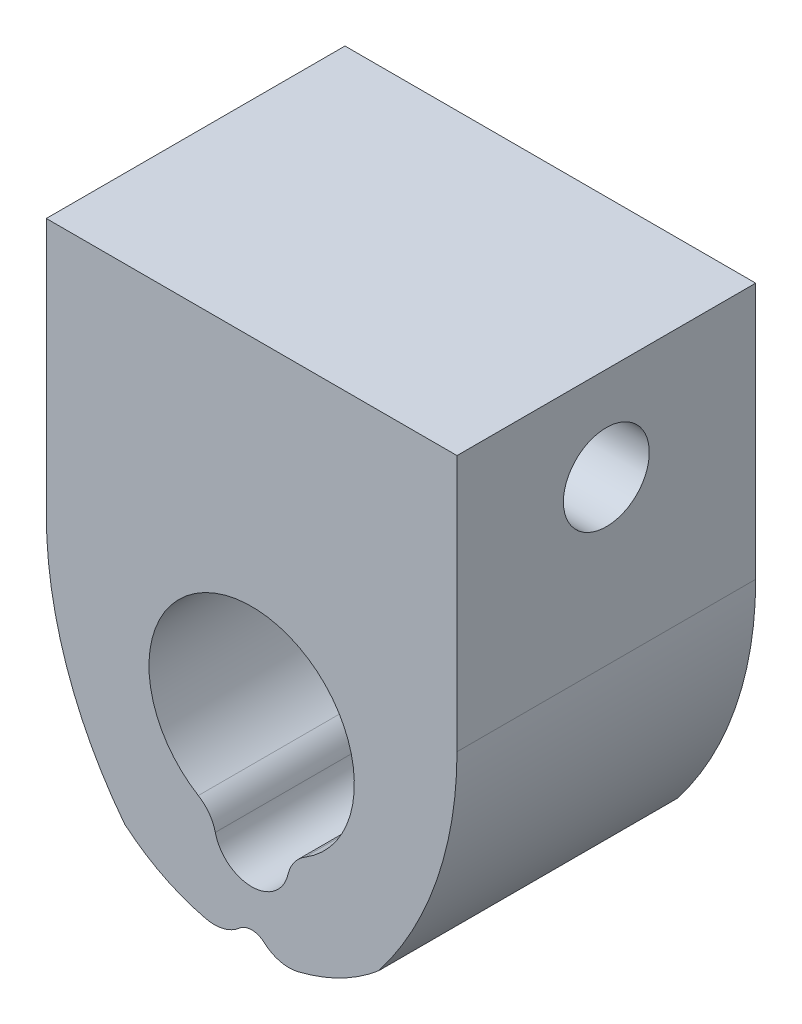
ISO-10303-21;
HEADER;
FILE_DESCRIPTION(('STEP AP214'),'2;1');
FILE_NAME('part.step','',(''),(''),'','','');
FILE_SCHEMA(('AUTOMOTIVE_DESIGN { 1 0 10303 214 1 1 1 1 }'));
ENDSEC;
DATA;
#1=APPLICATION_CONTEXT('core data for automotive mechanical design processes');
#2=APPLICATION_PROTOCOL_DEFINITION('international standard','automotive_design',2000,#1);
#3=PRODUCT_CONTEXT('',#1,'mechanical');
#4=PRODUCT('Part','Part','',(#3));
#5=PRODUCT_RELATED_PRODUCT_CATEGORY('part','',(#4));
#6=PRODUCT_DEFINITION_FORMATION('','',#4);
#7=PRODUCT_DEFINITION_CONTEXT('part definition',#1,'design');
#8=PRODUCT_DEFINITION('design','',#6,#7);
#9=PRODUCT_DEFINITION_SHAPE('','',#8);
#10=(LENGTH_UNIT() NAMED_UNIT(*) SI_UNIT(.MILLI.,.METRE.));
#11=(NAMED_UNIT(*) PLANE_ANGLE_UNIT() SI_UNIT($,.RADIAN.));
#12=(NAMED_UNIT(*) SI_UNIT($,.STERADIAN.) SOLID_ANGLE_UNIT());
#13=UNCERTAINTY_MEASURE_WITH_UNIT(LENGTH_MEASURE(1.E-05),#10,'distance_accuracy_value','');
#14=(GEOMETRIC_REPRESENTATION_CONTEXT(3) GLOBAL_UNCERTAINTY_ASSIGNED_CONTEXT((#13)) GLOBAL_UNIT_ASSIGNED_CONTEXT((#10,
#11,#12)) REPRESENTATION_CONTEXT('',''));
#15=CARTESIAN_POINT('',(0.,0.,0.));
#16=DIRECTION('',(0.,0.,1.));
#17=DIRECTION('',(1.,0.,0.));
#18=AXIS2_PLACEMENT_3D('',#15,#16,#17);
#19=CARTESIAN_POINT('',(0.998865569685858,-4.13095238095238,-6.91465834296967));
#20=DIRECTION('',(0.,0.,-1.));
#21=DIRECTION('',(-1.,0.,0.));
#22=AXIS2_PLACEMENT_3D('',#19,#20,#21);
#23=CYLINDRICAL_SURFACE('',#22,1.);
#24=CARTESIAN_POINT('',(0.998865569685858,-4.13095238095238,0.));
#25=DIRECTION('',(0.,0.,-1.));
#26=DIRECTION('',(-1.,0.,0.));
#27=AXIS2_PLACEMENT_3D('',#24,#25,#26);
#28=CIRCLE('',#27,1.);
#29=CARTESIAN_POINT('',(1.23389276255312,-5.10294117647059,0.));
#30=VERTEX_POINT('',#29);
#31=CARTESIAN_POINT('',(0.332955189895285,-4.87698412698413,0.));
#32=VERTEX_POINT('',#31);
#33=EDGE_CURVE('E260',#30,#32,#28,.T.);
#34=ORIENTED_EDGE('',*,*,#33,.F.);
#35=DIRECTION('',(0.,0.,-1.));
#36=VECTOR('',#35,1.);
#37=CARTESIAN_POINT('',(1.23389276255312,-5.10294117647059,-6.91465834296967));
#38=LINE('',#37,#36);
#39=CARTESIAN_POINT('',(1.23389276255312,-5.10294117647059,8.));
#40=VERTEX_POINT('',#39);
#41=EDGE_CURVE('E326',#40,#30,#38,.T.);
#42=ORIENTED_EDGE('',*,*,#41,.F.);
#43=CARTESIAN_POINT('',(0.998865569685858,-4.13095238095238,8.));
#44=DIRECTION('',(0.,0.,1.));
#45=DIRECTION('',(-1.,0.,0.));
#46=AXIS2_PLACEMENT_3D('',#43,#44,#45);
#47=CIRCLE('',#46,1.);
#48=CARTESIAN_POINT('',(0.332955189895285,-4.87698412698413,8.));
#49=VERTEX_POINT('',#48);
#50=EDGE_CURVE('E218',#49,#40,#47,.T.);
#51=ORIENTED_EDGE('',*,*,#50,.F.);
#52=DIRECTION('',(0.,0.,1.));
#53=VECTOR('',#52,1.);
#54=CARTESIAN_POINT('',(0.332955189895285,-4.87698412698413,0.));
#55=LINE('',#54,#53);
#56=EDGE_CURVE('E296',#32,#49,#55,.T.);
#57=ORIENTED_EDGE('',*,*,#56,.F.);
#58=EDGE_LOOP('',(#34,#42,#51,#57));
#59=FACE_BOUND('',#58,.T.);
#60=ADVANCED_FACE('F17',(#59),#23,.T.);
#61=CARTESIAN_POINT('',(-0.998865569685859,-4.13095238095238,-6.91465834296967));
#62=DIRECTION('',(0.,0.,1.));
#63=DIRECTION('',(1.,0.,0.));
#64=AXIS2_PLACEMENT_3D('',#61,#62,#63);
#65=CYLINDRICAL_SURFACE('',#64,1.);
#66=CARTESIAN_POINT('',(-0.998865569685859,-4.13095238095238,8.));
#67=DIRECTION('',(0.,0.,1.));
#68=DIRECTION('',(-1.,0.,0.));
#69=AXIS2_PLACEMENT_3D('',#66,#67,#68);
#70=CIRCLE('',#69,1.);
#71=CARTESIAN_POINT('',(-1.23389276255312,-5.10294117647059,8.));
#72=VERTEX_POINT('',#71);
#73=CARTESIAN_POINT('',(-0.332955189895287,-4.87698412698413,8.));
#74=VERTEX_POINT('',#73);
#75=EDGE_CURVE('E206',#72,#74,#70,.T.);
#76=ORIENTED_EDGE('',*,*,#75,.F.);
#77=DIRECTION('',(0.,0.,1.));
#78=VECTOR('',#77,1.);
#79=CARTESIAN_POINT('',(-1.23389276255312,-5.10294117647059,-6.91465834296967));
#80=LINE('',#79,#78);
#81=CARTESIAN_POINT('',(-1.23389276255312,-5.10294117647059,0.));
#82=VERTEX_POINT('',#81);
#83=EDGE_CURVE('E200',#82,#72,#80,.T.);
#84=ORIENTED_EDGE('',*,*,#83,.F.);
#85=CARTESIAN_POINT('',(-0.998865569685859,-4.13095238095238,0.));
#86=DIRECTION('',(0.,0.,-1.));
#87=DIRECTION('',(-1.,0.,0.));
#88=AXIS2_PLACEMENT_3D('',#85,#86,#87);
#89=CIRCLE('',#88,1.);
#90=CARTESIAN_POINT('',(-0.332955189895287,-4.87698412698413,0.));
#91=VERTEX_POINT('',#90);
#92=EDGE_CURVE('E251',#91,#82,#89,.T.);
#93=ORIENTED_EDGE('',*,*,#92,.F.);
#94=DIRECTION('',(0.,0.,-1.));
#95=VECTOR('',#94,1.);
#96=CARTESIAN_POINT('',(-0.332955189895287,-4.87698412698413,0.));
#97=LINE('',#96,#95);
#98=EDGE_CURVE('E298',#74,#91,#97,.T.);
#99=ORIENTED_EDGE('',*,*,#98,.F.);
#100=EDGE_LOOP('',(#76,#84,#93,#99));
#101=FACE_BOUND('',#100,.T.);
#102=ADVANCED_FACE('F316',(#101),#65,.T.);
#103=CARTESIAN_POINT('',(1.94766229869351,-3.20454545454546,8.));
#104=DIRECTION('',(0.,0.,-1.));
#105=DIRECTION('',(-1.,0.,0.));
#106=AXIS2_PLACEMENT_3D('',#103,#104,#105);
#107=CYLINDRICAL_SURFACE('',#106,1.);
#108=CARTESIAN_POINT('',(1.94766229869351,-3.20454545454546,8.));
#109=DIRECTION('',(0.,0.,1.));
#110=DIRECTION('',(-1.,0.,0.));
#111=AXIS2_PLACEMENT_3D('',#108,#109,#110);
#112=CIRCLE('',#111,1.);
#113=CARTESIAN_POINT('',(1.42828568570857,-2.35,8.));
#114=VERTEX_POINT('',#113);
#115=CARTESIAN_POINT('',(0.973831149346752,-2.97727272727273,8.));
#116=VERTEX_POINT('',#115);
#117=EDGE_CURVE('E152',#114,#116,#112,.T.);
#118=ORIENTED_EDGE('',*,*,#117,.F.);
#119=DIRECTION('',(0.,0.,1.));
#120=VECTOR('',#119,1.);
#121=CARTESIAN_POINT('',(1.42828568570857,-2.35,8.));
#122=LINE('',#121,#120);
#123=CARTESIAN_POINT('',(1.42828568570857,-2.35,0.));
#124=VERTEX_POINT('',#123);
#125=EDGE_CURVE('E160',#124,#114,#122,.T.);
#126=ORIENTED_EDGE('',*,*,#125,.F.);
#127=CARTESIAN_POINT('',(1.94766229869351,-3.20454545454546,0.));
#128=DIRECTION('',(0.,0.,-1.));
#129=DIRECTION('',(-1.,0.,0.));
#130=AXIS2_PLACEMENT_3D('',#127,#128,#129);
#131=CIRCLE('',#130,1.);
#132=CARTESIAN_POINT('',(0.973831149346752,-2.97727272727273,0.));
#133=VERTEX_POINT('',#132);
#134=EDGE_CURVE('E287',#133,#124,#131,.T.);
#135=ORIENTED_EDGE('',*,*,#134,.F.);
#136=DIRECTION('',(0.,0.,-1.));
#137=VECTOR('',#136,1.);
#138=CARTESIAN_POINT('',(0.973831149346752,-2.97727272727273,0.));
#139=LINE('',#138,#137);
#140=EDGE_CURVE('E11',#116,#133,#139,.T.);
#141=ORIENTED_EDGE('',*,*,#140,.F.);
#142=EDGE_LOOP('',(#118,#126,#135,#141));
#143=FACE_BOUND('',#142,.T.);
#144=ADVANCED_FACE('F156',(#143),#107,.T.);
#145=CARTESIAN_POINT('',(-1.94766229869351,-3.20454545454546,8.));
#146=DIRECTION('',(0.,0.,1.));
#147=DIRECTION('',(1.,0.,0.));
#148=AXIS2_PLACEMENT_3D('',#145,#146,#147);
#149=CYLINDRICAL_SURFACE('',#148,1.);
#150=CARTESIAN_POINT('',(-1.94766229869351,-3.20454545454546,0.));
#151=DIRECTION('',(0.,0.,-1.));
#152=DIRECTION('',(-1.,0.,0.));
#153=AXIS2_PLACEMENT_3D('',#150,#151,#152);
#154=CIRCLE('',#153,1.);
#155=CARTESIAN_POINT('',(-1.42828568570857,-2.35,0.));
#156=VERTEX_POINT('',#155);
#157=CARTESIAN_POINT('',(-0.973831149346752,-2.97727272727273,0.));
#158=VERTEX_POINT('',#157);
#159=EDGE_CURVE('E279',#156,#158,#154,.T.);
#160=ORIENTED_EDGE('',*,*,#159,.F.);
#161=DIRECTION('',(0.,0.,-1.));
#162=VECTOR('',#161,1.);
#163=CARTESIAN_POINT('',(-1.42828568570857,-2.35,8.));
#164=LINE('',#163,#162);
#165=CARTESIAN_POINT('',(-1.42828568570857,-2.35,8.));
#166=VERTEX_POINT('',#165);
#167=EDGE_CURVE('E197',#166,#156,#164,.T.);
#168=ORIENTED_EDGE('',*,*,#167,.F.);
#169=CARTESIAN_POINT('',(-1.94766229869351,-3.20454545454546,8.));
#170=DIRECTION('',(0.,0.,1.));
#171=DIRECTION('',(-1.,0.,0.));
#172=AXIS2_PLACEMENT_3D('',#169,#170,#171);
#173=CIRCLE('',#172,1.);
#174=CARTESIAN_POINT('',(-0.973831149346752,-2.97727272727273,8.));
#175=VERTEX_POINT('',#174);
#176=EDGE_CURVE('E163',#175,#166,#173,.T.);
#177=ORIENTED_EDGE('',*,*,#176,.F.);
#178=DIRECTION('',(0.,0.,1.));
#179=VECTOR('',#178,1.);
#180=CARTESIAN_POINT('',(-0.973831149346752,-2.97727272727273,0.));
#181=LINE('',#180,#179);
#182=EDGE_CURVE('E20',#158,#175,#181,.T.);
#183=ORIENTED_EDGE('',*,*,#182,.F.);
#184=EDGE_LOOP('',(#160,#168,#177,#183));
#185=FACE_BOUND('',#184,.T.);
#186=ADVANCED_FACE('F660',(#185),#149,.T.);
#187=CARTESIAN_POINT('',(0.,-2.75,0.));
#188=DIRECTION('',(0.,0.,1.));
#189=DIRECTION('',(1.,0.,0.));
#190=AXIS2_PLACEMENT_3D('',#187,#188,#189);
#191=CYLINDRICAL_SURFACE('',#190,1.);
#192=CARTESIAN_POINT('',(0.,-2.75,0.));
#193=DIRECTION('',(0.,0.,1.));
#194=DIRECTION('',(1.,0.,0.));
#195=AXIS2_PLACEMENT_3D('',#192,#193,#194);
#196=CIRCLE('',#195,1.);
#197=EDGE_CURVE('E282',#158,#133,#196,.T.);
#198=ORIENTED_EDGE('',*,*,#197,.F.);
#199=ORIENTED_EDGE('',*,*,#182,.T.);
#200=CARTESIAN_POINT('',(0.,-2.75,8.));
#201=DIRECTION('',(0.,0.,1.));
#202=DIRECTION('',(1.,0.,0.));
#203=AXIS2_PLACEMENT_3D('',#200,#201,#202);
#204=CIRCLE('',#203,1.);
#205=EDGE_CURVE('E233',#175,#116,#204,.T.);
#206=ORIENTED_EDGE('',*,*,#205,.T.);
#207=ORIENTED_EDGE('',*,*,#140,.T.);
#208=EDGE_LOOP('',(#198,#199,#206,#207));
#209=FACE_BOUND('',#208,.T.);
#210=ADVANCED_FACE('F647',(#209),#191,.F.);
#211=CARTESIAN_POINT('',(0.,-5.25,0.));
#212=DIRECTION('',(0.,0.,1.));
#213=DIRECTION('',(1.,0.,0.));
#214=AXIS2_PLACEMENT_3D('',#211,#212,#213);
#215=CYLINDRICAL_SURFACE('',#214,0.5);
#216=CARTESIAN_POINT('',(0.,-5.25,8.));
#217=DIRECTION('',(0.,0.,1.));
#218=DIRECTION('',(1.,0.,0.));
#219=AXIS2_PLACEMENT_3D('',#216,#217,#218);
#220=CIRCLE('',#219,0.5);
#221=EDGE_CURVE('E214',#49,#74,#220,.T.);
#222=ORIENTED_EDGE('',*,*,#221,.T.);
#223=ORIENTED_EDGE('',*,*,#98,.T.);
#224=CARTESIAN_POINT('',(0.,-5.25,0.));
#225=DIRECTION('',(0.,0.,1.));
#226=DIRECTION('',(1.,0.,0.));
#227=AXIS2_PLACEMENT_3D('',#224,#225,#226);
#228=CIRCLE('',#227,0.5);
#229=EDGE_CURVE('E162',#32,#91,#228,.T.);
#230=ORIENTED_EDGE('',*,*,#229,.F.);
#231=ORIENTED_EDGE('',*,*,#56,.T.);
#232=EDGE_LOOP('',(#222,#223,#230,#231));
#233=FACE_BOUND('',#232,.T.);
#234=ADVANCED_FACE('F315',(#233),#215,.F.);
#235=CARTESIAN_POINT('',(4.5,2.13059469834251,-6.91465834296967));
#236=DIRECTION('',(0.,0.,1.));
#237=DIRECTION('',(1.,0.,0.));
#238=AXIS2_PLACEMENT_3D('',#235,#236,#237);
#239=CYLINDRICAL_SURFACE('',#238,10.);
#240=CARTESIAN_POINT('',(4.5,2.13059469834251,8.));
#241=DIRECTION('',(0.,0.,1.));
#242=DIRECTION('',(-1.,0.,0.));
#243=AXIS2_PLACEMENT_3D('',#240,#241,#242);
#244=CIRCLE('',#243,10.);
#245=CARTESIAN_POINT('',(-5.5,2.13059469834251,8.));
#246=VERTEX_POINT('',#245);
#247=CARTESIAN_POINT('',(-3.40036762718386,-4.,8.));
#248=VERTEX_POINT('',#247);
#249=EDGE_CURVE('E238',#246,#248,#244,.T.);
#250=ORIENTED_EDGE('',*,*,#249,.F.);
#251=DIRECTION('',(0.,0.,1.));
#252=VECTOR('',#251,1.);
#253=CARTESIAN_POINT('',(-5.5,2.13059469834251,8.));
#254=LINE('',#253,#252);
#255=CARTESIAN_POINT('',(-5.5,2.13059469834251,0.));
#256=VERTEX_POINT('',#255);
#257=EDGE_CURVE('E294',#256,#246,#254,.T.);
#258=ORIENTED_EDGE('',*,*,#257,.F.);
#259=CARTESIAN_POINT('',(4.5,2.13059469834251,0.));
#260=DIRECTION('',(0.,0.,-1.));
#261=DIRECTION('',(-1.,0.,0.));
#262=AXIS2_PLACEMENT_3D('',#259,#260,#261);
#263=CIRCLE('',#262,10.);
#264=CARTESIAN_POINT('',(-3.40036762718386,-4.,0.));
#265=VERTEX_POINT('',#264);
#266=EDGE_CURVE('E191',#265,#256,#263,.T.);
#267=ORIENTED_EDGE('',*,*,#266,.F.);
#268=DIRECTION('',(0.,0.,1.));
#269=VECTOR('',#268,1.);
#270=CARTESIAN_POINT('',(-3.40036762718386,-4.,-6.91465834296967));
#271=LINE('',#270,#269);
#272=EDGE_CURVE('E247',#265,#248,#271,.T.);
#273=ORIENTED_EDGE('',*,*,#272,.T.);
#274=EDGE_LOOP('',(#250,#258,#267,#273));
#275=FACE_BOUND('',#274,.T.);
#276=ADVANCED_FACE('F337',(#275),#239,.T.);
#277=CARTESIAN_POINT('',(-4.5,2.13059469834251,-6.91465834296967));
#278=DIRECTION('',(0.,0.,1.));
#279=DIRECTION('',(1.,0.,0.));
#280=AXIS2_PLACEMENT_3D('',#277,#278,#279);
#281=CYLINDRICAL_SURFACE('',#280,10.);
#282=CARTESIAN_POINT('',(-4.5,2.13059469834251,8.));
#283=DIRECTION('',(0.,0.,1.));
#284=DIRECTION('',(-1.,0.,0.));
#285=AXIS2_PLACEMENT_3D('',#282,#283,#284);
#286=CIRCLE('',#285,10.);
#287=CARTESIAN_POINT('',(3.40036762718386,-4.,8.));
#288=VERTEX_POINT('',#287);
#289=CARTESIAN_POINT('',(5.5,2.13059469834251,8.));
#290=VERTEX_POINT('',#289);
#291=EDGE_CURVE('E225',#288,#290,#286,.T.);
#292=ORIENTED_EDGE('',*,*,#291,.F.);
#293=DIRECTION('',(0.,0.,1.));
#294=VECTOR('',#293,1.);
#295=CARTESIAN_POINT('',(3.40036762718386,-4.,-6.91465834296967));
#296=LINE('',#295,#294);
#297=CARTESIAN_POINT('',(3.40036762718386,-4.,0.));
#298=VERTEX_POINT('',#297);
#299=EDGE_CURVE('E210',#298,#288,#296,.T.);
#300=ORIENTED_EDGE('',*,*,#299,.F.);
#301=CARTESIAN_POINT('',(-4.5,2.13059469834251,0.));
#302=DIRECTION('',(0.,0.,-1.));
#303=DIRECTION('',(-1.,0.,0.));
#304=AXIS2_PLACEMENT_3D('',#301,#302,#303);
#305=CIRCLE('',#304,10.);
#306=CARTESIAN_POINT('',(5.5,2.13059469834251,0.));
#307=VERTEX_POINT('',#306);
#308=EDGE_CURVE('E255',#307,#298,#305,.T.);
#309=ORIENTED_EDGE('',*,*,#308,.F.);
#310=DIRECTION('',(0.,0.,-1.));
#311=VECTOR('',#310,1.);
#312=CARTESIAN_POINT('',(5.5,2.13059469834251,8.));
#313=LINE('',#312,#311);
#314=EDGE_CURVE('E286',#290,#307,#313,.T.);
#315=ORIENTED_EDGE('',*,*,#314,.F.);
#316=EDGE_LOOP('',(#292,#300,#309,#315));
#317=FACE_BOUND('',#316,.T.);
#318=ADVANCED_FACE('F351',(#317),#281,.T.);
#319=CARTESIAN_POINT('',(0.,0.,-6.91465834296967));
#320=DIRECTION('',(0.,0.,1.));
#321=DIRECTION('',(1.,0.,0.));
#322=AXIS2_PLACEMENT_3D('',#319,#320,#321);
#323=CYLINDRICAL_SURFACE('',#322,5.25);
#324=CARTESIAN_POINT('',(0.,0.,0.));
#325=DIRECTION('',(0.,0.,1.));
#326=DIRECTION('',(-1.,0.,0.));
#327=AXIS2_PLACEMENT_3D('',#324,#325,#326);
#328=CIRCLE('',#327,5.25);
#329=EDGE_CURVE('E194',#265,#82,#328,.T.);
#330=ORIENTED_EDGE('',*,*,#329,.T.);
#331=ORIENTED_EDGE('',*,*,#83,.T.);
#332=CARTESIAN_POINT('',(0.,0.,8.));
#333=DIRECTION('',(0.,0.,1.));
#334=DIRECTION('',(1.,0.,0.));
#335=AXIS2_PLACEMENT_3D('',#332,#333,#334);
#336=CIRCLE('',#335,5.25);
#337=EDGE_CURVE('E205',#248,#72,#336,.T.);
#338=ORIENTED_EDGE('',*,*,#337,.F.);
#339=ORIENTED_EDGE('',*,*,#272,.F.);
#340=EDGE_LOOP('',(#330,#331,#338,#339));
#341=FACE_BOUND('',#340,.T.);
#342=ADVANCED_FACE('F335',(#341),#323,.T.);
#343=CARTESIAN_POINT('',(14.9339811320566,9.,0.));
#344=DIRECTION('',(0.,1.,0.));
#345=DIRECTION('',(1.,0.,0.));
#346=AXIS2_PLACEMENT_3D('',#343,#344,#345);
#347=PLANE('',#346);
#348=DIRECTION('',(0.,0.,1.));
#349=VECTOR('',#348,1.);
#350=CARTESIAN_POINT('',(5.5,9.,0.));
#351=LINE('',#350,#349);
#352=CARTESIAN_POINT('',(5.5,9.,0.));
#353=VERTEX_POINT('',#352);
#354=CARTESIAN_POINT('',(5.5,9.,8.));
#355=VERTEX_POINT('',#354);
#356=EDGE_CURVE('E291',#353,#355,#351,.T.);
#357=ORIENTED_EDGE('',*,*,#356,.F.);
#358=DIRECTION('',(-1.,0.,0.));
#359=VECTOR('',#358,1.);
#360=CARTESIAN_POINT('',(14.9339811320566,9.,0.));
#361=LINE('',#360,#359);
#362=CARTESIAN_POINT('',(-5.5,9.,0.));
#363=VERTEX_POINT('',#362);
#364=EDGE_CURVE('E268',#353,#363,#361,.T.);
#365=ORIENTED_EDGE('',*,*,#364,.T.);
#366=DIRECTION('',(0.,0.,-1.));
#367=VECTOR('',#366,1.);
#368=CARTESIAN_POINT('',(-5.5,9.,0.));
#369=LINE('',#368,#367);
#370=CARTESIAN_POINT('',(-5.5,9.,8.));
#371=VERTEX_POINT('',#370);
#372=EDGE_CURVE('E199',#371,#363,#369,.T.);
#373=ORIENTED_EDGE('',*,*,#372,.F.);
#374=DIRECTION('',(-1.,0.,0.));
#375=VECTOR('',#374,1.);
#376=CARTESIAN_POINT('',(14.9339811320566,9.,8.));
#377=LINE('',#376,#375);
#378=EDGE_CURVE('E230',#355,#371,#377,.T.);
#379=ORIENTED_EDGE('',*,*,#378,.F.);
#380=EDGE_LOOP('',(#357,#365,#373,#379));
#381=FACE_BOUND('',#380,.T.);
#382=ADVANCED_FACE('F344',(#381),#347,.T.);
#383=CARTESIAN_POINT('',(-5.5,-4.,8.));
#384=DIRECTION('',(1.,0.,0.));
#385=DIRECTION('',(0.,1.,0.));
#386=AXIS2_PLACEMENT_3D('',#383,#384,#385);
#387=PLANE('',#386);
#388=CARTESIAN_POINT('',(-5.5,6.5,4.));
#389=DIRECTION('',(-1.,0.,0.));
#390=DIRECTION('',(0.,0.,1.));
#391=AXIS2_PLACEMENT_3D('',#388,#389,#390);
#392=CIRCLE('',#391,1.15);
#393=CARTESIAN_POINT('',(-5.5,6.5,5.15));
#394=VERTEX_POINT('',#393);
#395=EDGE_CURVE('E176',#394,#394,#392,.T.);
#396=ORIENTED_EDGE('',*,*,#395,.F.);
#397=EDGE_LOOP('',(#396));
#398=FACE_BOUND('',#397,.T.);
#399=DIRECTION('',(0.,-1.,0.));
#400=VECTOR('',#399,1.);
#401=CARTESIAN_POINT('',(-5.5,-4.,0.));
#402=LINE('',#401,#400);
#403=EDGE_CURVE('E192',#363,#256,#402,.T.);
#404=ORIENTED_EDGE('',*,*,#403,.T.);
#405=ORIENTED_EDGE('',*,*,#257,.T.);
#406=DIRECTION('',(0.,-1.,0.));
#407=VECTOR('',#406,1.);
#408=CARTESIAN_POINT('',(-5.5,-4.,8.));
#409=LINE('',#408,#407);
#410=EDGE_CURVE('E231',#371,#246,#409,.T.);
#411=ORIENTED_EDGE('',*,*,#410,.F.);
#412=ORIENTED_EDGE('',*,*,#372,.T.);
#413=EDGE_LOOP('',(#404,#405,#411,#412));
#414=FACE_BOUND('',#413,.T.);
#415=ADVANCED_FACE('F340',(#398,#414),#387,.F.);
#416=CARTESIAN_POINT('',(5.5,-4.,8.));
#417=DIRECTION('',(-1.,0.,0.));
#418=DIRECTION('',(0.,0.,1.));
#419=AXIS2_PLACEMENT_3D('',#416,#417,#418);
#420=PLANE('',#419);
#421=CARTESIAN_POINT('',(5.5,6.5,4.));
#422=DIRECTION('',(1.,0.,0.));
#423=DIRECTION('',(0.,0.,1.));
#424=AXIS2_PLACEMENT_3D('',#421,#422,#423);
#425=CIRCLE('',#424,1.15);
#426=CARTESIAN_POINT('',(5.5,6.5,5.15));
#427=VERTEX_POINT('',#426);
#428=EDGE_CURVE('E190',#427,#427,#425,.T.);
#429=ORIENTED_EDGE('',*,*,#428,.F.);
#430=EDGE_LOOP('',(#429));
#431=FACE_BOUND('',#430,.T.);
#432=DIRECTION('',(0.,1.,0.));
#433=VECTOR('',#432,1.);
#434=CARTESIAN_POINT('',(5.5,-4.,8.));
#435=LINE('',#434,#433);
#436=EDGE_CURVE('E226',#290,#355,#435,.T.);
#437=ORIENTED_EDGE('',*,*,#436,.F.);
#438=ORIENTED_EDGE('',*,*,#314,.T.);
#439=DIRECTION('',(0.,1.,0.));
#440=VECTOR('',#439,1.);
#441=CARTESIAN_POINT('',(5.5,-4.,0.));
#442=LINE('',#441,#440);
#443=EDGE_CURVE('E256',#307,#353,#442,.T.);
#444=ORIENTED_EDGE('',*,*,#443,.T.);
#445=ORIENTED_EDGE('',*,*,#356,.T.);
#446=EDGE_LOOP('',(#437,#438,#444,#445));
#447=FACE_BOUND('',#446,.T.);
#448=ADVANCED_FACE('F347',(#431,#447),#420,.F.);
#449=CARTESIAN_POINT('',(0.,0.,0.));
#450=DIRECTION('',(0.,0.,-1.));
#451=DIRECTION('',(0.,-1.,0.));
#452=AXIS2_PLACEMENT_3D('',#449,#450,#451);
#453=PLANE('',#452);
#454=CARTESIAN_POINT('',(0.,0.,0.));
#455=DIRECTION('',(0.,0.,1.));
#456=DIRECTION('',(1.,0.,0.));
#457=AXIS2_PLACEMENT_3D('',#454,#455,#456);
#458=CIRCLE('',#457,2.75);
#459=EDGE_CURVE('E171',#124,#156,#458,.T.);
#460=ORIENTED_EDGE('',*,*,#459,.T.);
#461=ORIENTED_EDGE('',*,*,#159,.T.);
#462=ORIENTED_EDGE('',*,*,#197,.T.);
#463=ORIENTED_EDGE('',*,*,#134,.T.);
#464=EDGE_LOOP('',(#460,#461,#462,#463));
#465=FACE_BOUND('',#464,.T.);
#466=ORIENTED_EDGE('',*,*,#229,.T.);
#467=ORIENTED_EDGE('',*,*,#92,.T.);
#468=ORIENTED_EDGE('',*,*,#329,.F.);
#469=ORIENTED_EDGE('',*,*,#266,.T.);
#470=ORIENTED_EDGE('',*,*,#403,.F.);
#471=ORIENTED_EDGE('',*,*,#364,.F.);
#472=ORIENTED_EDGE('',*,*,#443,.F.);
#473=ORIENTED_EDGE('',*,*,#308,.T.);
#474=CARTESIAN_POINT('',(0.,0.,0.));
#475=DIRECTION('',(0.,0.,1.));
#476=DIRECTION('',(-1.,0.,0.));
#477=AXIS2_PLACEMENT_3D('',#474,#475,#476);
#478=CIRCLE('',#477,5.25);
#479=EDGE_CURVE('E211',#30,#298,#478,.T.);
#480=ORIENTED_EDGE('',*,*,#479,.F.);
#481=ORIENTED_EDGE('',*,*,#33,.T.);
#482=EDGE_LOOP('',(#466,#467,#468,#469,#470,#471,#472,#473,#480,#481));
#483=FACE_BOUND('',#482,.T.);
#484=ADVANCED_FACE('F317',(#465,#483),#453,.T.);
#485=CARTESIAN_POINT('',(0.,0.,8.));
#486=DIRECTION('',(0.,0.,-1.));
#487=DIRECTION('',(0.,-1.,0.));
#488=AXIS2_PLACEMENT_3D('',#485,#486,#487);
#489=PLANE('',#488);
#490=ORIENTED_EDGE('',*,*,#205,.F.);
#491=ORIENTED_EDGE('',*,*,#176,.T.);
#492=CARTESIAN_POINT('',(0.,0.,8.));
#493=DIRECTION('',(0.,0.,1.));
#494=DIRECTION('',(1.,0.,0.));
#495=AXIS2_PLACEMENT_3D('',#492,#493,#494);
#496=CIRCLE('',#495,2.75);
#497=EDGE_CURVE('E166',#114,#166,#496,.T.);
#498=ORIENTED_EDGE('',*,*,#497,.F.);
#499=ORIENTED_EDGE('',*,*,#117,.T.);
#500=EDGE_LOOP('',(#490,#491,#498,#499));
#501=FACE_BOUND('',#500,.T.);
#502=ORIENTED_EDGE('',*,*,#337,.T.);
#503=ORIENTED_EDGE('',*,*,#75,.T.);
#504=ORIENTED_EDGE('',*,*,#221,.F.);
#505=ORIENTED_EDGE('',*,*,#50,.T.);
#506=CARTESIAN_POINT('',(0.,0.,8.));
#507=DIRECTION('',(0.,0.,1.));
#508=DIRECTION('',(1.,0.,0.));
#509=AXIS2_PLACEMENT_3D('',#506,#507,#508);
#510=CIRCLE('',#509,5.25);
#511=EDGE_CURVE('E174',#40,#288,#510,.T.);
#512=ORIENTED_EDGE('',*,*,#511,.T.);
#513=ORIENTED_EDGE('',*,*,#291,.T.);
#514=ORIENTED_EDGE('',*,*,#436,.T.);
#515=ORIENTED_EDGE('',*,*,#378,.T.);
#516=ORIENTED_EDGE('',*,*,#410,.T.);
#517=ORIENTED_EDGE('',*,*,#249,.T.);
#518=EDGE_LOOP('',(#502,#503,#504,#505,#512,#513,#514,#515,#516,#517));
#519=FACE_BOUND('',#518,.T.);
#520=ADVANCED_FACE('F177',(#501,#519),#489,.F.);
#521=CARTESIAN_POINT('',(0.,0.,-6.91465834296967));
#522=DIRECTION('',(0.,0.,1.));
#523=DIRECTION('',(1.,0.,0.));
#524=AXIS2_PLACEMENT_3D('',#521,#522,#523);
#525=CYLINDRICAL_SURFACE('',#524,5.25);
#526=ORIENTED_EDGE('',*,*,#511,.F.);
#527=ORIENTED_EDGE('',*,*,#41,.T.);
#528=ORIENTED_EDGE('',*,*,#479,.T.);
#529=ORIENTED_EDGE('',*,*,#299,.T.);
#530=EDGE_LOOP('',(#526,#527,#528,#529));
#531=FACE_BOUND('',#530,.T.);
#532=ADVANCED_FACE('F352',(#531),#525,.T.);
#533=CARTESIAN_POINT('',(0.,0.,8.));
#534=DIRECTION('',(0.,0.,-1.));
#535=DIRECTION('',(-1.,0.,0.));
#536=AXIS2_PLACEMENT_3D('',#533,#534,#535);
#537=CYLINDRICAL_SURFACE('',#536,2.75);
#538=ORIENTED_EDGE('',*,*,#497,.T.);
#539=ORIENTED_EDGE('',*,*,#167,.T.);
#540=ORIENTED_EDGE('',*,*,#459,.F.);
#541=ORIENTED_EDGE('',*,*,#125,.T.);
#542=EDGE_LOOP('',(#538,#539,#540,#541));
#543=FACE_BOUND('',#542,.T.);
#544=ADVANCED_FACE('F170',(#543),#537,.F.);
#545=CARTESIAN_POINT('',(14.9339811320566,6.5,4.));
#546=DIRECTION('',(-1.,0.,0.));
#547=DIRECTION('',(0.,0.,1.));
#548=AXIS2_PLACEMENT_3D('',#545,#546,#547);
#549=CYLINDRICAL_SURFACE('',#548,1.15);
#550=ORIENTED_EDGE('',*,*,#395,.T.);
#551=EDGE_LOOP('',(#550));
#552=FACE_BOUND('',#551,.T.);
#553=ORIENTED_EDGE('',*,*,#428,.T.);
#554=EDGE_LOOP('',(#553));
#555=FACE_BOUND('',#554,.T.);
#556=ADVANCED_FACE('F571',(#552,#555),#549,.F.);
#557=CLOSED_SHELL('',(#60,#102,#144,#186,#210,#234,#276,#318,#342,#382,#415,#448,#484,#520,#532,
#544,#556));
#558=MANIFOLD_SOLID_BREP('B1',#557);
#559=ADVANCED_BREP_SHAPE_REPRESENTATION('',(#18,#558),#14);
#560=SHAPE_DEFINITION_REPRESENTATION(#9,#559);
ENDSEC;
END-ISO-10303-21;
